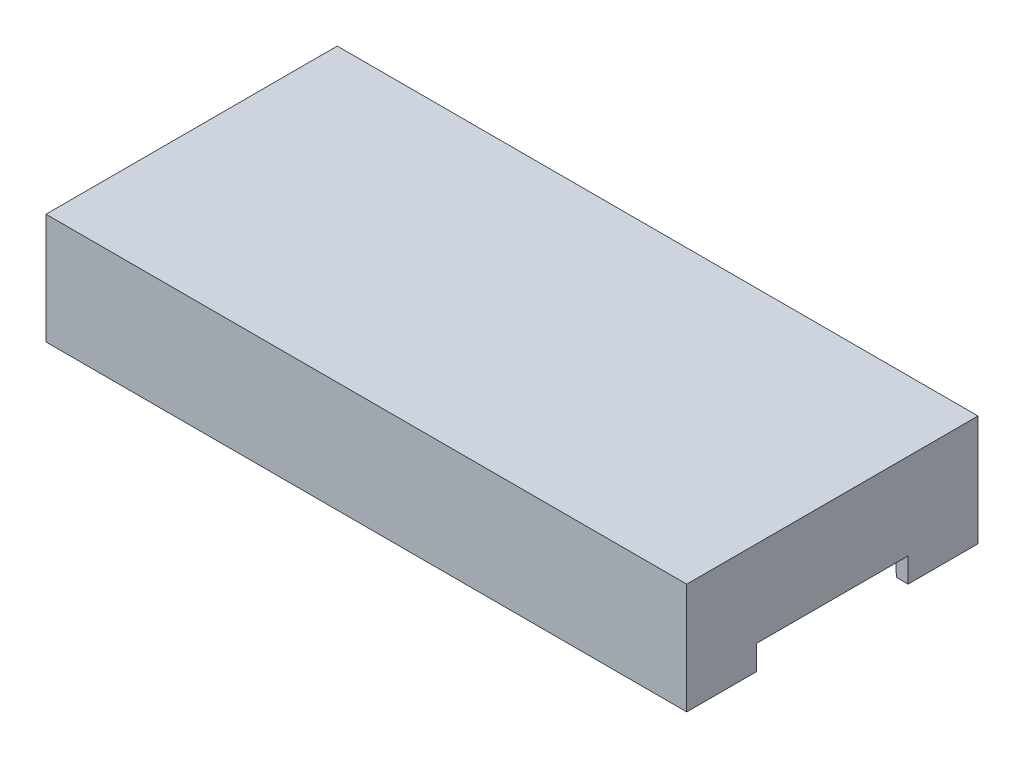
ISO-10303-21;
HEADER;
FILE_DESCRIPTION(('STEP AP214'),'2;1');
FILE_NAME('part.step','',(''),(''),'','','');
FILE_SCHEMA(('AUTOMOTIVE_DESIGN { 1 0 10303 214 1 1 1 1 }'));
ENDSEC;
DATA;
#1=APPLICATION_CONTEXT('core data for automotive mechanical design processes');
#2=APPLICATION_PROTOCOL_DEFINITION('international standard','automotive_design',2000,#1);
#3=PRODUCT_CONTEXT('',#1,'mechanical');
#4=PRODUCT('Part','Part','',(#3));
#5=PRODUCT_RELATED_PRODUCT_CATEGORY('part','',(#4));
#6=PRODUCT_DEFINITION_FORMATION('','',#4);
#7=PRODUCT_DEFINITION_CONTEXT('part definition',#1,'design');
#8=PRODUCT_DEFINITION('design','',#6,#7);
#9=PRODUCT_DEFINITION_SHAPE('','',#8);
#10=(LENGTH_UNIT() NAMED_UNIT(*) SI_UNIT(.MILLI.,.METRE.));
#11=(NAMED_UNIT(*) PLANE_ANGLE_UNIT() SI_UNIT($,.RADIAN.));
#12=(NAMED_UNIT(*) SI_UNIT($,.STERADIAN.) SOLID_ANGLE_UNIT());
#13=UNCERTAINTY_MEASURE_WITH_UNIT(LENGTH_MEASURE(1.E-05),#10,'distance_accuracy_value','');
#14=(GEOMETRIC_REPRESENTATION_CONTEXT(3) GLOBAL_UNCERTAINTY_ASSIGNED_CONTEXT((#13)) GLOBAL_UNIT_ASSIGNED_CONTEXT((#10,
#11,#12)) REPRESENTATION_CONTEXT('',''));
#15=CARTESIAN_POINT('',(0.,0.,0.));
#16=DIRECTION('',(0.,0.,1.));
#17=DIRECTION('',(1.,0.,0.));
#18=AXIS2_PLACEMENT_3D('',#15,#16,#17);
#19=CARTESIAN_POINT('',(0.,7.5,0.));
#20=DIRECTION('',(0.,-1.,0.));
#21=DIRECTION('',(0.,0.,-1.));
#22=AXIS2_PLACEMENT_3D('',#19,#20,#21);
#23=PLANE('',#22);
#24=DIRECTION('',(1.,0.,0.));
#25=VECTOR('',#24,1.);
#26=CARTESIAN_POINT('',(-27.501,7.5,-6.50000000000001));
#27=LINE('',#26,#25);
#28=CARTESIAN_POINT('',(26.5,7.5,-6.50000000000001));
#29=VERTEX_POINT('',#28);
#30=CARTESIAN_POINT('',(27.5,7.5,-6.50000000000001));
#31=VERTEX_POINT('',#30);
#32=EDGE_CURVE('E235',#29,#31,#27,.T.);
#33=ORIENTED_EDGE('',*,*,#32,.F.);
#34=DIRECTION('',(0.,0.,-1.));
#35=VECTOR('',#34,1.);
#36=CARTESIAN_POINT('',(26.5,7.5,0.));
#37=LINE('',#36,#35);
#38=CARTESIAN_POINT('',(26.5,7.5,-11.5));
#39=VERTEX_POINT('',#38);
#40=EDGE_CURVE('E191',#29,#39,#37,.T.);
#41=ORIENTED_EDGE('',*,*,#40,.T.);
#42=DIRECTION('',(-1.,0.,0.));
#43=VECTOR('',#42,1.);
#44=CARTESIAN_POINT('',(0.,7.5,-11.5));
#45=LINE('',#44,#43);
#46=CARTESIAN_POINT('',(-26.5,7.5,-11.5));
#47=VERTEX_POINT('',#46);
#48=EDGE_CURVE('E187',#39,#47,#45,.T.);
#49=ORIENTED_EDGE('',*,*,#48,.T.);
#50=DIRECTION('',(0.,0.,1.));
#51=VECTOR('',#50,1.);
#52=CARTESIAN_POINT('',(-26.5,7.5,0.));
#53=LINE('',#52,#51);
#54=CARTESIAN_POINT('',(-26.5,7.5,11.5));
#55=VERTEX_POINT('',#54);
#56=EDGE_CURVE('E185',#47,#55,#53,.T.);
#57=ORIENTED_EDGE('',*,*,#56,.T.);
#58=DIRECTION('',(1.,0.,0.));
#59=VECTOR('',#58,1.);
#60=CARTESIAN_POINT('',(0.,7.5,11.5));
#61=LINE('',#60,#59);
#62=CARTESIAN_POINT('',(26.5,7.5,11.5));
#63=VERTEX_POINT('',#62);
#64=EDGE_CURVE('E166',#55,#63,#61,.T.);
#65=ORIENTED_EDGE('',*,*,#64,.T.);
#66=DIRECTION('',(0.,0.,-1.));
#67=VECTOR('',#66,1.);
#68=CARTESIAN_POINT('',(26.5,7.5,0.));
#69=LINE('',#68,#67);
#70=CARTESIAN_POINT('',(26.5,7.5,6.49999999999999));
#71=VERTEX_POINT('',#70);
#72=EDGE_CURVE('E176',#63,#71,#69,.T.);
#73=ORIENTED_EDGE('',*,*,#72,.T.);
#74=DIRECTION('',(1.,0.,0.));
#75=VECTOR('',#74,1.);
#76=CARTESIAN_POINT('',(-27.501,7.5,6.49999999999999));
#77=LINE('',#76,#75);
#78=CARTESIAN_POINT('',(27.5,7.5,6.49999999999999));
#79=VERTEX_POINT('',#78);
#80=EDGE_CURVE('E261',#71,#79,#77,.T.);
#81=ORIENTED_EDGE('',*,*,#80,.T.);
#82=DIRECTION('',(0.,0.,1.));
#83=VECTOR('',#82,1.);
#84=CARTESIAN_POINT('',(27.5,7.5,-10.5));
#85=LINE('',#84,#83);
#86=CARTESIAN_POINT('',(27.5,7.5,12.5));
#87=VERTEX_POINT('',#86);
#88=EDGE_CURVE('E264',#79,#87,#85,.T.);
#89=ORIENTED_EDGE('',*,*,#88,.T.);
#90=DIRECTION('',(-1.,0.,0.));
#91=VECTOR('',#90,1.);
#92=CARTESIAN_POINT('',(-25.5,7.5,12.5));
#93=LINE('',#92,#91);
#94=CARTESIAN_POINT('',(-27.5,7.5,12.5));
#95=VERTEX_POINT('',#94);
#96=EDGE_CURVE('E224',#87,#95,#93,.T.);
#97=ORIENTED_EDGE('',*,*,#96,.T.);
#98=DIRECTION('',(0.,0.,-1.));
#99=VECTOR('',#98,1.);
#100=CARTESIAN_POINT('',(-27.5,7.5,-10.5));
#101=LINE('',#100,#99);
#102=CARTESIAN_POINT('',(-27.5,7.5,-12.5));
#103=VERTEX_POINT('',#102);
#104=EDGE_CURVE('E270',#95,#103,#101,.T.);
#105=ORIENTED_EDGE('',*,*,#104,.T.);
#106=DIRECTION('',(1.,0.,0.));
#107=VECTOR('',#106,1.);
#108=CARTESIAN_POINT('',(-25.5,7.5,-12.5));
#109=LINE('',#108,#107);
#110=CARTESIAN_POINT('',(27.5,7.5,-12.5));
#111=VERTEX_POINT('',#110);
#112=EDGE_CURVE('E267',#103,#111,#109,.T.);
#113=ORIENTED_EDGE('',*,*,#112,.T.);
#114=EDGE_CURVE('E263',#111,#31,#85,.T.);
#115=ORIENTED_EDGE('',*,*,#114,.T.);
#116=EDGE_LOOP('',(#33,#41,#49,#57,#65,#73,#81,#89,#97,#105,#113,#115));
#117=FACE_BOUND('',#116,.T.);
#118=ADVANCED_FACE('F36',(#117),#23,.T.);
#119=CARTESIAN_POINT('',(25.5,15.,-10.5));
#120=DIRECTION('',(-1.,0.,0.));
#121=DIRECTION('',(0.,0.,1.));
#122=AXIS2_PLACEMENT_3D('',#119,#120,#121);
#123=PLANE('',#122);
#124=DIRECTION('',(0.,-1.,0.));
#125=VECTOR('',#124,1.);
#126=CARTESIAN_POINT('',(25.5,15.,-10.5));
#127=LINE('',#126,#125);
#128=CARTESIAN_POINT('',(25.5,15.,-10.5));
#129=VERTEX_POINT('',#128);
#130=CARTESIAN_POINT('',(25.5,9.5,-10.5));
#131=VERTEX_POINT('',#130);
#132=EDGE_CURVE('E280',#129,#131,#127,.T.);
#133=ORIENTED_EDGE('',*,*,#132,.T.);
#134=DIRECTION('',(0.,0.,1.));
#135=VECTOR('',#134,1.);
#136=CARTESIAN_POINT('',(25.5,9.5,-10.5));
#137=LINE('',#136,#135);
#138=CARTESIAN_POINT('',(25.5,9.5,-6.50000000000001));
#139=VERTEX_POINT('',#138);
#140=EDGE_CURVE('E212',#131,#139,#137,.T.);
#141=ORIENTED_EDGE('',*,*,#140,.T.);
#142=DIRECTION('',(0.,-1.,0.));
#143=VECTOR('',#142,1.);
#144=CARTESIAN_POINT('',(25.5,0.,-6.50000000000001));
#145=LINE('',#144,#143);
#146=CARTESIAN_POINT('',(25.5,9.60000000000001,-6.50000000000001));
#147=VERTEX_POINT('',#146);
#148=EDGE_CURVE('E250',#147,#139,#145,.T.);
#149=ORIENTED_EDGE('',*,*,#148,.F.);
#150=DIRECTION('',(0.,0.,-1.));
#151=VECTOR('',#150,1.);
#152=CARTESIAN_POINT('',(25.5,9.60000000000001,0.));
#153=LINE('',#152,#151);
#154=CARTESIAN_POINT('',(25.5,9.6,6.49999999999999));
#155=VERTEX_POINT('',#154);
#156=EDGE_CURVE('E257',#155,#147,#153,.T.);
#157=ORIENTED_EDGE('',*,*,#156,.F.);
#158=DIRECTION('',(0.,-1.,0.));
#159=VECTOR('',#158,1.);
#160=CARTESIAN_POINT('',(25.5,0.,6.49999999999999));
#161=LINE('',#160,#159);
#162=CARTESIAN_POINT('',(25.5,9.5,6.49999999999999));
#163=VERTEX_POINT('',#162);
#164=EDGE_CURVE('E253',#155,#163,#161,.T.);
#165=ORIENTED_EDGE('',*,*,#164,.T.);
#166=CARTESIAN_POINT('',(25.5,9.5,10.5));
#167=VERTEX_POINT('',#166);
#168=EDGE_CURVE('E51',#163,#167,#137,.T.);
#169=ORIENTED_EDGE('',*,*,#168,.T.);
#170=DIRECTION('',(0.,-1.,0.));
#171=VECTOR('',#170,1.);
#172=CARTESIAN_POINT('',(25.5,15.,10.5));
#173=LINE('',#172,#171);
#174=CARTESIAN_POINT('',(25.5,15.,10.5));
#175=VERTEX_POINT('',#174);
#176=EDGE_CURVE('E283',#175,#167,#173,.T.);
#177=ORIENTED_EDGE('',*,*,#176,.F.);
#178=DIRECTION('',(0.,0.,-1.));
#179=VECTOR('',#178,1.);
#180=CARTESIAN_POINT('',(25.5,15.,-10.5));
#181=LINE('',#180,#179);
#182=EDGE_CURVE('E225',#175,#129,#181,.T.);
#183=ORIENTED_EDGE('',*,*,#182,.T.);
#184=EDGE_LOOP('',(#133,#141,#149,#157,#165,#169,#177,#183));
#185=FACE_BOUND('',#184,.T.);
#186=ADVANCED_FACE('F333',(#185),#123,.T.);
#187=CARTESIAN_POINT('',(-25.5,15.,-10.5));
#188=DIRECTION('',(0.,0.,1.));
#189=DIRECTION('',(1.,0.,0.));
#190=AXIS2_PLACEMENT_3D('',#187,#188,#189);
#191=PLANE('',#190);
#192=DIRECTION('',(0.,-1.,0.));
#193=VECTOR('',#192,1.);
#194=CARTESIAN_POINT('',(-25.5,15.,-10.5));
#195=LINE('',#194,#193);
#196=CARTESIAN_POINT('',(-25.5,15.,-10.5));
#197=VERTEX_POINT('',#196);
#198=CARTESIAN_POINT('',(-25.5,9.5,-10.5));
#199=VERTEX_POINT('',#198);
#200=EDGE_CURVE('E277',#197,#199,#195,.T.);
#201=ORIENTED_EDGE('',*,*,#200,.T.);
#202=DIRECTION('',(1.,0.,0.));
#203=VECTOR('',#202,1.);
#204=CARTESIAN_POINT('',(-25.5,9.5,-10.5));
#205=LINE('',#204,#203);
#206=EDGE_CURVE('E218',#199,#131,#205,.T.);
#207=ORIENTED_EDGE('',*,*,#206,.T.);
#208=ORIENTED_EDGE('',*,*,#132,.F.);
#209=DIRECTION('',(-1.,0.,0.));
#210=VECTOR('',#209,1.);
#211=CARTESIAN_POINT('',(-25.5,15.,-10.5));
#212=LINE('',#211,#210);
#213=EDGE_CURVE('E229',#129,#197,#212,.T.);
#214=ORIENTED_EDGE('',*,*,#213,.T.);
#215=EDGE_LOOP('',(#201,#207,#208,#214));
#216=FACE_BOUND('',#215,.T.);
#217=ADVANCED_FACE('F358',(#216),#191,.T.);
#218=CARTESIAN_POINT('',(-25.5,15.,-10.5));
#219=DIRECTION('',(1.,0.,0.));
#220=DIRECTION('',(0.,0.,-1.));
#221=AXIS2_PLACEMENT_3D('',#218,#219,#220);
#222=PLANE('',#221);
#223=DIRECTION('',(0.,-1.,0.));
#224=VECTOR('',#223,1.);
#225=CARTESIAN_POINT('',(-25.5,15.,10.5));
#226=LINE('',#225,#224);
#227=CARTESIAN_POINT('',(-25.5,15.,10.5));
#228=VERTEX_POINT('',#227);
#229=CARTESIAN_POINT('',(-25.5,9.5,10.5));
#230=VERTEX_POINT('',#229);
#231=EDGE_CURVE('E228',#228,#230,#226,.T.);
#232=ORIENTED_EDGE('',*,*,#231,.T.);
#233=DIRECTION('',(0.,0.,-1.));
#234=VECTOR('',#233,1.);
#235=CARTESIAN_POINT('',(-25.5,9.5,-10.5));
#236=LINE('',#235,#234);
#237=EDGE_CURVE('E215',#230,#199,#236,.T.);
#238=ORIENTED_EDGE('',*,*,#237,.T.);
#239=ORIENTED_EDGE('',*,*,#200,.F.);
#240=DIRECTION('',(0.,0.,1.));
#241=VECTOR('',#240,1.);
#242=CARTESIAN_POINT('',(-25.5,15.,-10.5));
#243=LINE('',#242,#241);
#244=EDGE_CURVE('E231',#197,#228,#243,.T.);
#245=ORIENTED_EDGE('',*,*,#244,.T.);
#246=EDGE_LOOP('',(#232,#238,#239,#245));
#247=FACE_BOUND('',#246,.T.);
#248=ADVANCED_FACE('F365',(#247),#222,.T.);
#249=CARTESIAN_POINT('',(-25.5,15.,10.5));
#250=DIRECTION('',(0.,0.,-1.));
#251=DIRECTION('',(-1.,0.,0.));
#252=AXIS2_PLACEMENT_3D('',#249,#250,#251);
#253=PLANE('',#252);
#254=ORIENTED_EDGE('',*,*,#176,.T.);
#255=DIRECTION('',(-1.,0.,0.));
#256=VECTOR('',#255,1.);
#257=CARTESIAN_POINT('',(-25.5,9.5,10.5));
#258=LINE('',#257,#256);
#259=EDGE_CURVE('E211',#167,#230,#258,.T.);
#260=ORIENTED_EDGE('',*,*,#259,.T.);
#261=ORIENTED_EDGE('',*,*,#231,.F.);
#262=DIRECTION('',(1.,0.,0.));
#263=VECTOR('',#262,1.);
#264=CARTESIAN_POINT('',(-25.5,15.,10.5));
#265=LINE('',#264,#263);
#266=EDGE_CURVE('E233',#228,#175,#265,.T.);
#267=ORIENTED_EDGE('',*,*,#266,.T.);
#268=EDGE_LOOP('',(#254,#260,#261,#267));
#269=FACE_BOUND('',#268,.T.);
#270=ADVANCED_FACE('F38',(#269),#253,.T.);
#271=CARTESIAN_POINT('',(-27.501,0.,-6.50000000000001));
#272=DIRECTION('',(0.,0.,1.));
#273=DIRECTION('',(0.,-1.,0.));
#274=AXIS2_PLACEMENT_3D('',#271,#272,#273);
#275=PLANE('',#274);
#276=DIRECTION('',(1.,0.,0.));
#277=VECTOR('',#276,1.);
#278=CARTESIAN_POINT('',(-27.501,9.5,-6.50000000000001));
#279=LINE('',#278,#277);
#280=CARTESIAN_POINT('',(26.3951844414339,9.5,-6.50000000000001));
#281=VERTEX_POINT('',#280);
#282=EDGE_CURVE('E221',#139,#281,#279,.T.);
#283=ORIENTED_EDGE('',*,*,#282,.T.);
#284=DIRECTION('',(-0.0523359562429438,0.998629534754574,0.));
#285=VECTOR('',#284,1.);
#286=CARTESIAN_POINT('',(26.7440701731448,2.84286366482725,-6.50000000000001));
#287=LINE('',#286,#285);
#288=EDGE_CURVE('E12',#281,#29,#287,.F.);
#289=ORIENTED_EDGE('',*,*,#288,.T.);
#290=ORIENTED_EDGE('',*,*,#32,.T.);
#291=DIRECTION('',(0.,-1.,0.));
#292=VECTOR('',#291,1.);
#293=CARTESIAN_POINT('',(27.5,0.,-6.50000000000001));
#294=LINE('',#293,#292);
#295=CARTESIAN_POINT('',(27.5,9.60000000000001,-6.50000000000001));
#296=VERTEX_POINT('',#295);
#297=EDGE_CURVE('E251',#296,#31,#294,.T.);
#298=ORIENTED_EDGE('',*,*,#297,.F.);
#299=DIRECTION('',(1.,0.,0.));
#300=VECTOR('',#299,1.);
#301=CARTESIAN_POINT('',(-27.501,9.60000000000001,-6.50000000000001));
#302=LINE('',#301,#300);
#303=EDGE_CURVE('E247',#147,#296,#302,.T.);
#304=ORIENTED_EDGE('',*,*,#303,.F.);
#305=ORIENTED_EDGE('',*,*,#148,.T.);
#306=EDGE_LOOP('',(#283,#289,#290,#298,#304,#305));
#307=FACE_BOUND('',#306,.T.);
#308=ADVANCED_FACE('F327',(#307),#275,.T.);
#309=CARTESIAN_POINT('',(-27.501,0.,6.49999999999999));
#310=DIRECTION('',(0.,0.,1.));
#311=DIRECTION('',(0.,-1.,0.));
#312=AXIS2_PLACEMENT_3D('',#309,#310,#311);
#313=PLANE('',#312);
#314=DIRECTION('',(-0.0523359562429438,0.998629534754574,0.));
#315=VECTOR('',#314,1.);
#316=CARTESIAN_POINT('',(26.7440701731448,2.84286366482725,6.49999999999999));
#317=LINE('',#316,#315);
#318=CARTESIAN_POINT('',(26.3951844414339,9.5,6.49999999999999));
#319=VERTEX_POINT('',#318);
#320=EDGE_CURVE('E44',#319,#71,#317,.F.);
#321=ORIENTED_EDGE('',*,*,#320,.F.);
#322=DIRECTION('',(1.,0.,0.));
#323=VECTOR('',#322,1.);
#324=CARTESIAN_POINT('',(-27.501,9.5,6.49999999999999));
#325=LINE('',#324,#323);
#326=EDGE_CURVE('E259',#163,#319,#325,.T.);
#327=ORIENTED_EDGE('',*,*,#326,.F.);
#328=ORIENTED_EDGE('',*,*,#164,.F.);
#329=DIRECTION('',(1.,0.,0.));
#330=VECTOR('',#329,1.);
#331=CARTESIAN_POINT('',(-27.501,9.6,6.49999999999999));
#332=LINE('',#331,#330);
#333=CARTESIAN_POINT('',(27.5,9.6,6.49999999999999));
#334=VERTEX_POINT('',#333);
#335=EDGE_CURVE('E59',#155,#334,#332,.T.);
#336=ORIENTED_EDGE('',*,*,#335,.T.);
#337=DIRECTION('',(0.,-1.,0.));
#338=VECTOR('',#337,1.);
#339=CARTESIAN_POINT('',(27.5,0.,6.49999999999999));
#340=LINE('',#339,#338);
#341=EDGE_CURVE('E246',#334,#79,#340,.T.);
#342=ORIENTED_EDGE('',*,*,#341,.T.);
#343=ORIENTED_EDGE('',*,*,#80,.F.);
#344=EDGE_LOOP('',(#321,#327,#328,#336,#342,#343));
#345=FACE_BOUND('',#344,.T.);
#346=ADVANCED_FACE('F303',(#345),#313,.F.);
#347=CARTESIAN_POINT('',(27.5,15.,-10.5));
#348=DIRECTION('',(-1.,0.,0.));
#349=DIRECTION('',(0.,0.,1.));
#350=AXIS2_PLACEMENT_3D('',#347,#348,#349);
#351=PLANE('',#350);
#352=ORIENTED_EDGE('',*,*,#114,.F.);
#353=DIRECTION('',(0.,-1.,0.));
#354=VECTOR('',#353,1.);
#355=CARTESIAN_POINT('',(27.5,15.,-12.5));
#356=LINE('',#355,#354);
#357=CARTESIAN_POINT('',(27.5,17.,-12.5));
#358=VERTEX_POINT('',#357);
#359=EDGE_CURVE('E286',#358,#111,#356,.T.);
#360=ORIENTED_EDGE('',*,*,#359,.F.);
#361=DIRECTION('',(0.,0.,-1.));
#362=VECTOR('',#361,1.);
#363=CARTESIAN_POINT('',(27.5,17.,-10.5));
#364=LINE('',#363,#362);
#365=CARTESIAN_POINT('',(27.5,17.,12.5));
#366=VERTEX_POINT('',#365);
#367=EDGE_CURVE('E243',#366,#358,#364,.T.);
#368=ORIENTED_EDGE('',*,*,#367,.F.);
#369=DIRECTION('',(0.,-1.,0.));
#370=VECTOR('',#369,1.);
#371=CARTESIAN_POINT('',(27.5,15.,12.5));
#372=LINE('',#371,#370);
#373=EDGE_CURVE('E239',#366,#87,#372,.T.);
#374=ORIENTED_EDGE('',*,*,#373,.T.);
#375=ORIENTED_EDGE('',*,*,#88,.F.);
#376=ORIENTED_EDGE('',*,*,#341,.F.);
#377=DIRECTION('',(0.,0.,-1.));
#378=VECTOR('',#377,1.);
#379=CARTESIAN_POINT('',(27.5,9.60000000000001,0.));
#380=LINE('',#379,#378);
#381=EDGE_CURVE('E254',#334,#296,#380,.T.);
#382=ORIENTED_EDGE('',*,*,#381,.T.);
#383=ORIENTED_EDGE('',*,*,#297,.T.);
#384=EDGE_LOOP('',(#352,#360,#368,#374,#375,#376,#382,#383));
#385=FACE_BOUND('',#384,.T.);
#386=ADVANCED_FACE('F325',(#385),#351,.F.);
#387=CARTESIAN_POINT('',(-25.5,15.,-12.5));
#388=DIRECTION('',(0.,0.,1.));
#389=DIRECTION('',(1.,0.,0.));
#390=AXIS2_PLACEMENT_3D('',#387,#388,#389);
#391=PLANE('',#390);
#392=ORIENTED_EDGE('',*,*,#112,.F.);
#393=DIRECTION('',(0.,-1.,0.));
#394=VECTOR('',#393,1.);
#395=CARTESIAN_POINT('',(-27.5,15.,-12.5));
#396=LINE('',#395,#394);
#397=CARTESIAN_POINT('',(-27.5,17.,-12.5));
#398=VERTEX_POINT('',#397);
#399=EDGE_CURVE('E288',#398,#103,#396,.T.);
#400=ORIENTED_EDGE('',*,*,#399,.F.);
#401=DIRECTION('',(-1.,0.,0.));
#402=VECTOR('',#401,1.);
#403=CARTESIAN_POINT('',(-25.5,17.,-12.5));
#404=LINE('',#403,#402);
#405=EDGE_CURVE('E241',#358,#398,#404,.T.);
#406=ORIENTED_EDGE('',*,*,#405,.F.);
#407=ORIENTED_EDGE('',*,*,#359,.T.);
#408=EDGE_LOOP('',(#392,#400,#406,#407));
#409=FACE_BOUND('',#408,.T.);
#410=ADVANCED_FACE('F323',(#409),#391,.F.);
#411=CARTESIAN_POINT('',(-27.5,15.,-10.5));
#412=DIRECTION('',(1.,0.,0.));
#413=DIRECTION('',(0.,0.,-1.));
#414=AXIS2_PLACEMENT_3D('',#411,#412,#413);
#415=PLANE('',#414);
#416=ORIENTED_EDGE('',*,*,#104,.F.);
#417=DIRECTION('',(0.,-1.,0.));
#418=VECTOR('',#417,1.);
#419=CARTESIAN_POINT('',(-27.5,15.,12.5));
#420=LINE('',#419,#418);
#421=CARTESIAN_POINT('',(-27.5,17.,12.5));
#422=VERTEX_POINT('',#421);
#423=EDGE_CURVE('E290',#422,#95,#420,.T.);
#424=ORIENTED_EDGE('',*,*,#423,.F.);
#425=DIRECTION('',(0.,0.,1.));
#426=VECTOR('',#425,1.);
#427=CARTESIAN_POINT('',(-27.5,17.,-10.5));
#428=LINE('',#427,#426);
#429=EDGE_CURVE('E238',#398,#422,#428,.T.);
#430=ORIENTED_EDGE('',*,*,#429,.F.);
#431=ORIENTED_EDGE('',*,*,#399,.T.);
#432=EDGE_LOOP('',(#416,#424,#430,#431));
#433=FACE_BOUND('',#432,.T.);
#434=ADVANCED_FACE('F317',(#433),#415,.F.);
#435=CARTESIAN_POINT('',(-25.5,15.,12.5));
#436=DIRECTION('',(0.,0.,-1.));
#437=DIRECTION('',(-1.,0.,0.));
#438=AXIS2_PLACEMENT_3D('',#435,#436,#437);
#439=PLANE('',#438);
#440=ORIENTED_EDGE('',*,*,#96,.F.);
#441=ORIENTED_EDGE('',*,*,#373,.F.);
#442=DIRECTION('',(1.,0.,0.));
#443=VECTOR('',#442,1.);
#444=CARTESIAN_POINT('',(-25.5,17.,12.5));
#445=LINE('',#444,#443);
#446=EDGE_CURVE('E236',#422,#366,#445,.T.);
#447=ORIENTED_EDGE('',*,*,#446,.F.);
#448=ORIENTED_EDGE('',*,*,#423,.T.);
#449=EDGE_LOOP('',(#440,#441,#447,#448));
#450=FACE_BOUND('',#449,.T.);
#451=ADVANCED_FACE('F310',(#450),#439,.F.);
#452=CARTESIAN_POINT('',(0.,15.,0.));
#453=DIRECTION('',(0.,1.,0.));
#454=DIRECTION('',(0.,0.,1.));
#455=AXIS2_PLACEMENT_3D('',#452,#453,#454);
#456=PLANE('',#455);
#457=ORIENTED_EDGE('',*,*,#182,.F.);
#458=ORIENTED_EDGE('',*,*,#266,.F.);
#459=ORIENTED_EDGE('',*,*,#244,.F.);
#460=ORIENTED_EDGE('',*,*,#213,.F.);
#461=EDGE_LOOP('',(#457,#458,#459,#460));
#462=FACE_BOUND('',#461,.T.);
#463=ADVANCED_FACE('F380',(#462),#456,.F.);
#464=CARTESIAN_POINT('',(-27.501,9.60000000000001,0.));
#465=DIRECTION('',(0.,-1.,0.));
#466=DIRECTION('',(0.,0.,-1.));
#467=AXIS2_PLACEMENT_3D('',#464,#465,#466);
#468=PLANE('',#467);
#469=ORIENTED_EDGE('',*,*,#156,.T.);
#470=ORIENTED_EDGE('',*,*,#303,.T.);
#471=ORIENTED_EDGE('',*,*,#381,.F.);
#472=ORIENTED_EDGE('',*,*,#335,.F.);
#473=EDGE_LOOP('',(#469,#470,#471,#472));
#474=FACE_BOUND('',#473,.T.);
#475=ADVANCED_FACE('F328',(#474),#468,.T.);
#476=CARTESIAN_POINT('',(0.,17.,0.));
#477=DIRECTION('',(0.,1.,0.));
#478=DIRECTION('',(0.,0.,1.));
#479=AXIS2_PLACEMENT_3D('',#476,#477,#478);
#480=PLANE('',#479);
#481=ORIENTED_EDGE('',*,*,#367,.T.);
#482=ORIENTED_EDGE('',*,*,#405,.T.);
#483=ORIENTED_EDGE('',*,*,#429,.T.);
#484=ORIENTED_EDGE('',*,*,#446,.T.);
#485=EDGE_LOOP('',(#481,#482,#483,#484));
#486=FACE_BOUND('',#485,.T.);
#487=ADVANCED_FACE('F389',(#486),#480,.T.);
#488=CARTESIAN_POINT('',(26.5,7.5,0.));
#489=DIRECTION('',(0.998629534754574,0.0523359562429438,0.));
#490=DIRECTION('',(-0.0523359562429438,0.998629534754574,0.));
#491=AXIS2_PLACEMENT_3D('',#488,#489,#490);
#492=PLANE('',#491);
#493=ORIENTED_EDGE('',*,*,#320,.T.);
#494=ORIENTED_EDGE('',*,*,#72,.F.);
#495=DIRECTION('',(0.0522644276887139,-0.997264688634237,0.0522644276887139));
#496=VECTOR('',#495,1.);
#497=CARTESIAN_POINT('',(26.4685869403813,8.09939688436477,11.4685869403813));
#498=LINE('',#497,#496);
#499=CARTESIAN_POINT('',(26.3951844414339,9.5,11.3951844414339));
#500=VERTEX_POINT('',#499);
#501=EDGE_CURVE('E162',#500,#63,#498,.T.);
#502=ORIENTED_EDGE('',*,*,#501,.F.);
#503=DIRECTION('',(0.,0.,1.));
#504=VECTOR('',#503,1.);
#505=CARTESIAN_POINT('',(26.3951844414339,9.5,0.));
#506=LINE('',#505,#504);
#507=EDGE_CURVE('E194',#500,#319,#506,.F.);
#508=ORIENTED_EDGE('',*,*,#507,.T.);
#509=EDGE_LOOP('',(#493,#494,#502,#508));
#510=FACE_BOUND('',#509,.T.);
#511=ADVANCED_FACE('F177',(#510),#492,.F.);
#512=CARTESIAN_POINT('',(26.5,7.5,0.));
#513=DIRECTION('',(0.998629534754574,0.0523359562429438,0.));
#514=DIRECTION('',(-0.0523359562429438,0.998629534754574,0.));
#515=AXIS2_PLACEMENT_3D('',#512,#513,#514);
#516=PLANE('',#515);
#517=DIRECTION('',(0.,0.,1.));
#518=VECTOR('',#517,1.);
#519=CARTESIAN_POINT('',(26.3951844414339,9.5,0.));
#520=LINE('',#519,#518);
#521=CARTESIAN_POINT('',(26.3951844414339,9.5,-11.3951844414339));
#522=VERTEX_POINT('',#521);
#523=EDGE_CURVE('E198',#281,#522,#520,.F.);
#524=ORIENTED_EDGE('',*,*,#523,.T.);
#525=DIRECTION('',(0.0522644276887139,-0.997264688634237,-0.0522644276887139));
#526=VECTOR('',#525,1.);
#527=CARTESIAN_POINT('',(26.4276133843568,8.88121890744925,-11.4276133843568));
#528=LINE('',#527,#526);
#529=EDGE_CURVE('E195',#522,#39,#528,.T.);
#530=ORIENTED_EDGE('',*,*,#529,.T.);
#531=ORIENTED_EDGE('',*,*,#40,.F.);
#532=ORIENTED_EDGE('',*,*,#288,.F.);
#533=EDGE_LOOP('',(#524,#530,#531,#532));
#534=FACE_BOUND('',#533,.T.);
#535=ADVANCED_FACE('F339',(#534),#516,.F.);
#536=CARTESIAN_POINT('',(0.,7.5,11.5));
#537=DIRECTION('',(0.,0.0523359562429438,0.998629534754574));
#538=DIRECTION('',(0.,-0.998629534754574,0.0523359562429438));
#539=AXIS2_PLACEMENT_3D('',#536,#537,#538);
#540=PLANE('',#539);
#541=ORIENTED_EDGE('',*,*,#64,.F.);
#542=DIRECTION('',(-0.0522644276887139,-0.997264688634237,0.0522644276887139));
#543=VECTOR('',#542,1.);
#544=CARTESIAN_POINT('',(-26.4276133843568,8.88121890744925,11.4276133843568));
#545=LINE('',#544,#543);
#546=CARTESIAN_POINT('',(-26.3951844414339,9.5,11.3951844414339));
#547=VERTEX_POINT('',#546);
#548=EDGE_CURVE('E173',#547,#55,#545,.T.);
#549=ORIENTED_EDGE('',*,*,#548,.F.);
#550=DIRECTION('',(-1.,0.,0.));
#551=VECTOR('',#550,1.);
#552=CARTESIAN_POINT('',(0.,9.5,11.3951844414339));
#553=LINE('',#552,#551);
#554=EDGE_CURVE('E169',#547,#500,#553,.F.);
#555=ORIENTED_EDGE('',*,*,#554,.T.);
#556=ORIENTED_EDGE('',*,*,#501,.T.);
#557=EDGE_LOOP('',(#541,#549,#555,#556));
#558=FACE_BOUND('',#557,.T.);
#559=ADVANCED_FACE('F164',(#558),#540,.F.);
#560=CARTESIAN_POINT('',(-26.5,7.5,0.));
#561=DIRECTION('',(-0.998629534754574,0.0523359562429438,0.));
#562=DIRECTION('',(-0.0523359562429438,-0.998629534754574,0.));
#563=AXIS2_PLACEMENT_3D('',#560,#561,#562);
#564=PLANE('',#563);
#565=ORIENTED_EDGE('',*,*,#56,.F.);
#566=DIRECTION('',(-0.0522644276887139,-0.997264688634237,-0.0522644276887139));
#567=VECTOR('',#566,1.);
#568=CARTESIAN_POINT('',(-26.4685869403813,8.09939688436477,-11.4685869403813));
#569=LINE('',#568,#567);
#570=CARTESIAN_POINT('',(-26.3951844414339,9.5,-11.3951844414339));
#571=VERTEX_POINT('',#570);
#572=EDGE_CURVE('E197',#571,#47,#569,.T.);
#573=ORIENTED_EDGE('',*,*,#572,.F.);
#574=DIRECTION('',(0.,0.,-1.));
#575=VECTOR('',#574,1.);
#576=CARTESIAN_POINT('',(-26.3951844414339,9.5,0.));
#577=LINE('',#576,#575);
#578=EDGE_CURVE('E205',#571,#547,#577,.F.);
#579=ORIENTED_EDGE('',*,*,#578,.T.);
#580=ORIENTED_EDGE('',*,*,#548,.T.);
#581=EDGE_LOOP('',(#565,#573,#579,#580));
#582=FACE_BOUND('',#581,.T.);
#583=ADVANCED_FACE('F344',(#582),#564,.F.);
#584=CARTESIAN_POINT('',(0.,7.5,-11.5));
#585=DIRECTION('',(0.,0.0523359562429438,-0.998629534754574));
#586=DIRECTION('',(0.,0.998629534754574,0.0523359562429438));
#587=AXIS2_PLACEMENT_3D('',#584,#585,#586);
#588=PLANE('',#587);
#589=ORIENTED_EDGE('',*,*,#48,.F.);
#590=ORIENTED_EDGE('',*,*,#529,.F.);
#591=DIRECTION('',(1.,0.,0.));
#592=VECTOR('',#591,1.);
#593=CARTESIAN_POINT('',(0.,9.5,-11.3951844414339));
#594=LINE('',#593,#592);
#595=EDGE_CURVE('E202',#522,#571,#594,.F.);
#596=ORIENTED_EDGE('',*,*,#595,.T.);
#597=ORIENTED_EDGE('',*,*,#572,.T.);
#598=EDGE_LOOP('',(#589,#590,#596,#597));
#599=FACE_BOUND('',#598,.T.);
#600=ADVANCED_FACE('F342',(#599),#588,.F.);
#601=CARTESIAN_POINT('',(0.,9.5,0.));
#602=DIRECTION('',(0.,-1.,0.));
#603=DIRECTION('',(0.,0.,-1.));
#604=AXIS2_PLACEMENT_3D('',#601,#602,#603);
#605=PLANE('',#604);
#606=ORIENTED_EDGE('',*,*,#140,.F.);
#607=ORIENTED_EDGE('',*,*,#206,.F.);
#608=ORIENTED_EDGE('',*,*,#237,.F.);
#609=ORIENTED_EDGE('',*,*,#259,.F.);
#610=ORIENTED_EDGE('',*,*,#168,.F.);
#611=ORIENTED_EDGE('',*,*,#326,.T.);
#612=ORIENTED_EDGE('',*,*,#507,.F.);
#613=ORIENTED_EDGE('',*,*,#554,.F.);
#614=ORIENTED_EDGE('',*,*,#578,.F.);
#615=ORIENTED_EDGE('',*,*,#595,.F.);
#616=ORIENTED_EDGE('',*,*,#523,.F.);
#617=ORIENTED_EDGE('',*,*,#282,.F.);
#618=EDGE_LOOP('',(#606,#607,#608,#609,#610,#611,#612,#613,#614,#615,#616,#617));
#619=FACE_BOUND('',#618,.T.);
#620=ADVANCED_FACE('F301',(#619),#605,.T.);
#621=CLOSED_SHELL('',(#118,#186,#217,#248,#270,#308,#346,#386,#410,#434,#451,#463,#475,#487,
#511,#535,#559,#583,#600,#620));
#622=MANIFOLD_SOLID_BREP('B2',#621);
#623=ADVANCED_BREP_SHAPE_REPRESENTATION('',(#18,#622),#14);
#624=SHAPE_DEFINITION_REPRESENTATION(#9,#623);
ENDSEC;
END-ISO-10303-21;
